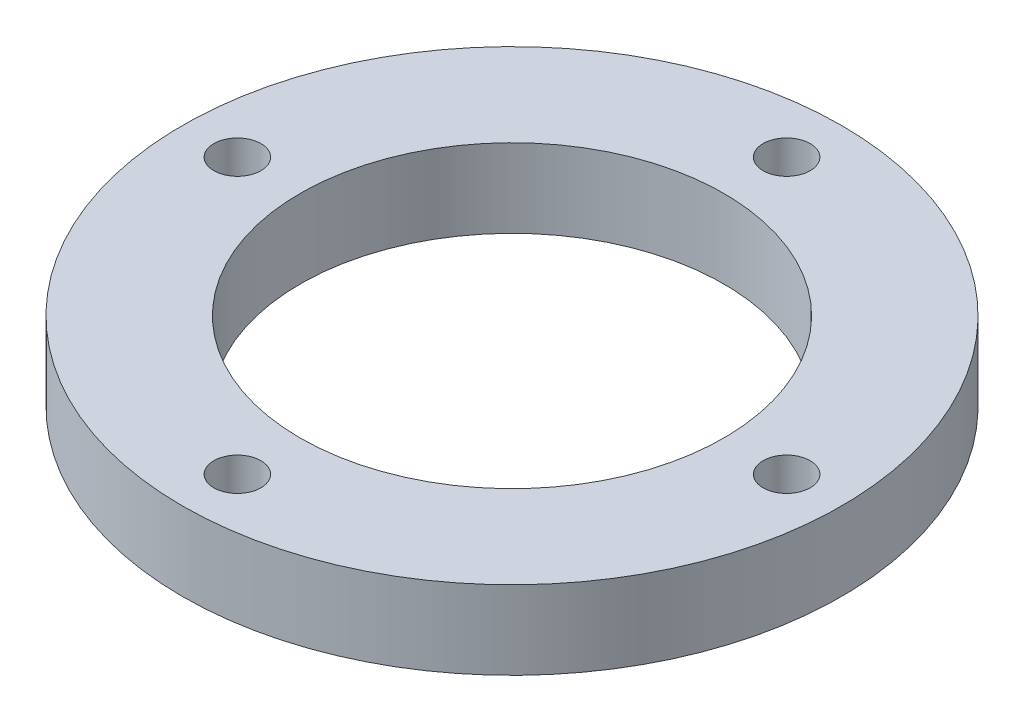
ISO-10303-21;
HEADER;
FILE_DESCRIPTION(('STEP AP214'),'2;1');
FILE_NAME('part.step','',(''),(''),'','','');
FILE_SCHEMA(('AUTOMOTIVE_DESIGN { 1 0 10303 214 1 1 1 1 }'));
ENDSEC;
DATA;
#1=APPLICATION_CONTEXT('core data for automotive mechanical design processes');
#2=APPLICATION_PROTOCOL_DEFINITION('international standard','automotive_design',2000,#1);
#3=PRODUCT_CONTEXT('',#1,'mechanical');
#4=PRODUCT('Part','Part','',(#3));
#5=PRODUCT_RELATED_PRODUCT_CATEGORY('part','',(#4));
#6=PRODUCT_DEFINITION_FORMATION('','',#4);
#7=PRODUCT_DEFINITION_CONTEXT('part definition',#1,'design');
#8=PRODUCT_DEFINITION('design','',#6,#7);
#9=PRODUCT_DEFINITION_SHAPE('','',#8);
#10=(LENGTH_UNIT() NAMED_UNIT(*) SI_UNIT(.MILLI.,.METRE.));
#11=(NAMED_UNIT(*) PLANE_ANGLE_UNIT() SI_UNIT($,.RADIAN.));
#12=(NAMED_UNIT(*) SI_UNIT($,.STERADIAN.) SOLID_ANGLE_UNIT());
#13=UNCERTAINTY_MEASURE_WITH_UNIT(LENGTH_MEASURE(1.E-05),#10,'distance_accuracy_value','');
#14=(GEOMETRIC_REPRESENTATION_CONTEXT(3) GLOBAL_UNCERTAINTY_ASSIGNED_CONTEXT((#13)) GLOBAL_UNIT_ASSIGNED_CONTEXT((#10,
#11,#12)) REPRESENTATION_CONTEXT('',''));
#15=CARTESIAN_POINT('',(0.,0.,0.));
#16=DIRECTION('',(0.,0.,1.));
#17=DIRECTION('',(1.,0.,0.));
#18=AXIS2_PLACEMENT_3D('',#15,#16,#17);
#19=CARTESIAN_POINT('',(0.,2.5,0.));
#20=DIRECTION('',(0.,1.,0.));
#21=DIRECTION('',(0.,0.,1.));
#22=AXIS2_PLACEMENT_3D('',#19,#20,#21);
#23=PLANE('',#22);
#24=CARTESIAN_POINT('',(0.,2.5,17.5));
#25=DIRECTION('',(0.,1.,0.));
#26=DIRECTION('',(0.,0.,1.));
#27=AXIS2_PLACEMENT_3D('',#24,#25,#26);
#28=CIRCLE('',#27,1.5);
#29=CARTESIAN_POINT('',(0.,2.5,19.));
#30=VERTEX_POINT('',#29);
#31=EDGE_CURVE('E59',#30,#30,#28,.T.);
#32=ORIENTED_EDGE('',*,*,#31,.F.);
#33=EDGE_LOOP('',(#32));
#34=FACE_BOUND('',#33,.T.);
#35=CARTESIAN_POINT('',(0.,2.5,-17.5));
#36=DIRECTION('',(0.,1.,0.));
#37=DIRECTION('',(0.,0.,1.));
#38=AXIS2_PLACEMENT_3D('',#35,#36,#37);
#39=CIRCLE('',#38,1.5);
#40=CARTESIAN_POINT('',(0.,2.5,-16.));
#41=VERTEX_POINT('',#40);
#42=EDGE_CURVE('E47',#41,#41,#39,.T.);
#43=ORIENTED_EDGE('',*,*,#42,.F.);
#44=EDGE_LOOP('',(#43));
#45=FACE_BOUND('',#44,.T.);
#46=CARTESIAN_POINT('',(0.,2.5,0.));
#47=DIRECTION('',(0.,1.,0.));
#48=DIRECTION('',(0.,0.,1.));
#49=AXIS2_PLACEMENT_3D('',#46,#47,#48);
#50=CIRCLE('',#49,21.);
#51=CARTESIAN_POINT('',(0.,2.5,21.));
#52=VERTEX_POINT('',#51);
#53=EDGE_CURVE('E10',#52,#52,#50,.T.);
#54=ORIENTED_EDGE('',*,*,#53,.T.);
#55=EDGE_LOOP('',(#54));
#56=FACE_BOUND('',#55,.T.);
#57=CARTESIAN_POINT('',(0.,2.5,0.));
#58=DIRECTION('',(0.,1.,0.));
#59=DIRECTION('',(0.,0.,1.));
#60=AXIS2_PLACEMENT_3D('',#57,#58,#59);
#61=CIRCLE('',#60,13.5);
#62=CARTESIAN_POINT('',(0.,2.5,13.5));
#63=VERTEX_POINT('',#62);
#64=EDGE_CURVE('E42',#63,#63,#61,.T.);
#65=ORIENTED_EDGE('',*,*,#64,.F.);
#66=EDGE_LOOP('',(#65));
#67=FACE_BOUND('',#66,.T.);
#68=CARTESIAN_POINT('',(17.5,2.5,0.));
#69=DIRECTION('',(0.,1.,0.));
#70=DIRECTION('',(0.,0.,1.));
#71=AXIS2_PLACEMENT_3D('',#68,#69,#70);
#72=CIRCLE('',#71,1.5);
#73=CARTESIAN_POINT('',(17.5,2.5,1.5));
#74=VERTEX_POINT('',#73);
#75=EDGE_CURVE('E53',#74,#74,#72,.T.);
#76=ORIENTED_EDGE('',*,*,#75,.F.);
#77=EDGE_LOOP('',(#76));
#78=FACE_BOUND('',#77,.T.);
#79=CARTESIAN_POINT('',(-17.5,2.5,0.));
#80=DIRECTION('',(0.,1.,0.));
#81=DIRECTION('',(0.,0.,1.));
#82=AXIS2_PLACEMENT_3D('',#79,#80,#81);
#83=CIRCLE('',#82,1.5);
#84=CARTESIAN_POINT('',(-17.5,2.5,1.5));
#85=VERTEX_POINT('',#84);
#86=EDGE_CURVE('E65',#85,#85,#83,.T.);
#87=ORIENTED_EDGE('',*,*,#86,.F.);
#88=EDGE_LOOP('',(#87));
#89=FACE_BOUND('',#88,.T.);
#90=ADVANCED_FACE('F31',(#34,#45,#56,#67,#78,#89),#23,.T.);
#91=CARTESIAN_POINT('',(0.,-2.5,0.));
#92=DIRECTION('',(0.,1.,0.));
#93=DIRECTION('',(0.,0.,1.));
#94=AXIS2_PLACEMENT_3D('',#91,#92,#93);
#95=PLANE('',#94);
#96=CARTESIAN_POINT('',(0.,-2.5,0.));
#97=DIRECTION('',(0.,1.,0.));
#98=DIRECTION('',(0.,0.,1.));
#99=AXIS2_PLACEMENT_3D('',#96,#97,#98);
#100=CIRCLE('',#99,21.);
#101=CARTESIAN_POINT('',(0.,-2.5,21.));
#102=VERTEX_POINT('',#101);
#103=EDGE_CURVE('E35',#102,#102,#100,.T.);
#104=ORIENTED_EDGE('',*,*,#103,.F.);
#105=EDGE_LOOP('',(#104));
#106=FACE_BOUND('',#105,.T.);
#107=CARTESIAN_POINT('',(0.,-2.5,0.));
#108=DIRECTION('',(0.,1.,0.));
#109=DIRECTION('',(0.,0.,1.));
#110=AXIS2_PLACEMENT_3D('',#107,#108,#109);
#111=CIRCLE('',#110,13.5);
#112=CARTESIAN_POINT('',(0.,-2.5,13.5));
#113=VERTEX_POINT('',#112);
#114=EDGE_CURVE('E44',#113,#113,#111,.T.);
#115=ORIENTED_EDGE('',*,*,#114,.T.);
#116=EDGE_LOOP('',(#115));
#117=FACE_BOUND('',#116,.T.);
#118=CARTESIAN_POINT('',(0.,-2.5,-17.5));
#119=DIRECTION('',(0.,1.,0.));
#120=DIRECTION('',(0.,0.,1.));
#121=AXIS2_PLACEMENT_3D('',#118,#119,#120);
#122=CIRCLE('',#121,1.5);
#123=CARTESIAN_POINT('',(0.,-2.5,-16.));
#124=VERTEX_POINT('',#123);
#125=EDGE_CURVE('E50',#124,#124,#122,.T.);
#126=ORIENTED_EDGE('',*,*,#125,.T.);
#127=EDGE_LOOP('',(#126));
#128=FACE_BOUND('',#127,.T.);
#129=CARTESIAN_POINT('',(17.5,-2.5,0.));
#130=DIRECTION('',(0.,1.,0.));
#131=DIRECTION('',(0.,0.,1.));
#132=AXIS2_PLACEMENT_3D('',#129,#130,#131);
#133=CIRCLE('',#132,1.5);
#134=CARTESIAN_POINT('',(17.5,-2.5,1.5));
#135=VERTEX_POINT('',#134);
#136=EDGE_CURVE('E56',#135,#135,#133,.T.);
#137=ORIENTED_EDGE('',*,*,#136,.T.);
#138=EDGE_LOOP('',(#137));
#139=FACE_BOUND('',#138,.T.);
#140=CARTESIAN_POINT('',(0.,-2.5,17.5));
#141=DIRECTION('',(0.,1.,0.));
#142=DIRECTION('',(0.,0.,1.));
#143=AXIS2_PLACEMENT_3D('',#140,#141,#142);
#144=CIRCLE('',#143,1.5);
#145=CARTESIAN_POINT('',(0.,-2.5,19.));
#146=VERTEX_POINT('',#145);
#147=EDGE_CURVE('E62',#146,#146,#144,.T.);
#148=ORIENTED_EDGE('',*,*,#147,.T.);
#149=EDGE_LOOP('',(#148));
#150=FACE_BOUND('',#149,.T.);
#151=CARTESIAN_POINT('',(-17.5,-2.5,0.));
#152=DIRECTION('',(0.,1.,0.));
#153=DIRECTION('',(0.,0.,1.));
#154=AXIS2_PLACEMENT_3D('',#151,#152,#153);
#155=CIRCLE('',#154,1.5);
#156=CARTESIAN_POINT('',(-17.5,-2.5,1.5));
#157=VERTEX_POINT('',#156);
#158=EDGE_CURVE('E68',#157,#157,#155,.T.);
#159=ORIENTED_EDGE('',*,*,#158,.T.);
#160=EDGE_LOOP('',(#159));
#161=FACE_BOUND('',#160,.T.);
#162=ADVANCED_FACE('F78',(#106,#117,#128,#139,#150,#161),#95,.F.);
#163=CARTESIAN_POINT('',(0.,2.5,0.));
#164=DIRECTION('',(0.,-1.,0.));
#165=DIRECTION('',(0.,0.,-1.));
#166=AXIS2_PLACEMENT_3D('',#163,#164,#165);
#167=CYLINDRICAL_SURFACE('',#166,21.);
#168=ORIENTED_EDGE('',*,*,#53,.F.);
#169=EDGE_LOOP('',(#168));
#170=FACE_BOUND('',#169,.T.);
#171=ORIENTED_EDGE('',*,*,#103,.T.);
#172=EDGE_LOOP('',(#171));
#173=FACE_BOUND('',#172,.T.);
#174=ADVANCED_FACE('F33',(#170,#173),#167,.T.);
#175=CARTESIAN_POINT('',(0.,2.5,0.));
#176=DIRECTION('',(0.,-1.,0.));
#177=DIRECTION('',(0.,0.,-1.));
#178=AXIS2_PLACEMENT_3D('',#175,#176,#177);
#179=CYLINDRICAL_SURFACE('',#178,13.5);
#180=ORIENTED_EDGE('',*,*,#64,.T.);
#181=EDGE_LOOP('',(#180));
#182=FACE_BOUND('',#181,.T.);
#183=ORIENTED_EDGE('',*,*,#114,.F.);
#184=EDGE_LOOP('',(#183));
#185=FACE_BOUND('',#184,.T.);
#186=ADVANCED_FACE('F88',(#182,#185),#179,.F.);
#187=CARTESIAN_POINT('',(0.,2.5,-17.5));
#188=DIRECTION('',(0.,-1.,0.));
#189=DIRECTION('',(0.,0.,-1.));
#190=AXIS2_PLACEMENT_3D('',#187,#188,#189);
#191=CYLINDRICAL_SURFACE('',#190,1.5);
#192=ORIENTED_EDGE('',*,*,#42,.T.);
#193=EDGE_LOOP('',(#192));
#194=FACE_BOUND('',#193,.T.);
#195=ORIENTED_EDGE('',*,*,#125,.F.);
#196=EDGE_LOOP('',(#195));
#197=FACE_BOUND('',#196,.T.);
#198=ADVANCED_FACE('F91',(#194,#197),#191,.F.);
#199=CARTESIAN_POINT('',(17.5,2.5,0.));
#200=DIRECTION('',(0.,-1.,0.));
#201=DIRECTION('',(0.,0.,-1.));
#202=AXIS2_PLACEMENT_3D('',#199,#200,#201);
#203=CYLINDRICAL_SURFACE('',#202,1.5);
#204=ORIENTED_EDGE('',*,*,#75,.T.);
#205=EDGE_LOOP('',(#204));
#206=FACE_BOUND('',#205,.T.);
#207=ORIENTED_EDGE('',*,*,#136,.F.);
#208=EDGE_LOOP('',(#207));
#209=FACE_BOUND('',#208,.T.);
#210=ADVANCED_FACE('F95',(#206,#209),#203,.F.);
#211=CARTESIAN_POINT('',(0.,2.5,17.5));
#212=DIRECTION('',(0.,-1.,0.));
#213=DIRECTION('',(0.,0.,-1.));
#214=AXIS2_PLACEMENT_3D('',#211,#212,#213);
#215=CYLINDRICAL_SURFACE('',#214,1.5);
#216=ORIENTED_EDGE('',*,*,#31,.T.);
#217=EDGE_LOOP('',(#216));
#218=FACE_BOUND('',#217,.T.);
#219=ORIENTED_EDGE('',*,*,#147,.F.);
#220=EDGE_LOOP('',(#219));
#221=FACE_BOUND('',#220,.T.);
#222=ADVANCED_FACE('F99',(#218,#221),#215,.F.);
#223=CARTESIAN_POINT('',(-17.5,2.5,0.));
#224=DIRECTION('',(0.,-1.,0.));
#225=DIRECTION('',(0.,0.,-1.));
#226=AXIS2_PLACEMENT_3D('',#223,#224,#225);
#227=CYLINDRICAL_SURFACE('',#226,1.5);
#228=ORIENTED_EDGE('',*,*,#86,.T.);
#229=EDGE_LOOP('',(#228));
#230=FACE_BOUND('',#229,.T.);
#231=ORIENTED_EDGE('',*,*,#158,.F.);
#232=EDGE_LOOP('',(#231));
#233=FACE_BOUND('',#232,.T.);
#234=ADVANCED_FACE('F74',(#230,#233),#227,.F.);
#235=CLOSED_SHELL('',(#90,#162,#174,#186,#198,#210,#222,#234));
#236=MANIFOLD_SOLID_BREP('B2',#235);
#237=ADVANCED_BREP_SHAPE_REPRESENTATION('',(#18,#236),#14);
#238=SHAPE_DEFINITION_REPRESENTATION(#9,#237);
ENDSEC;
END-ISO-10303-21;
